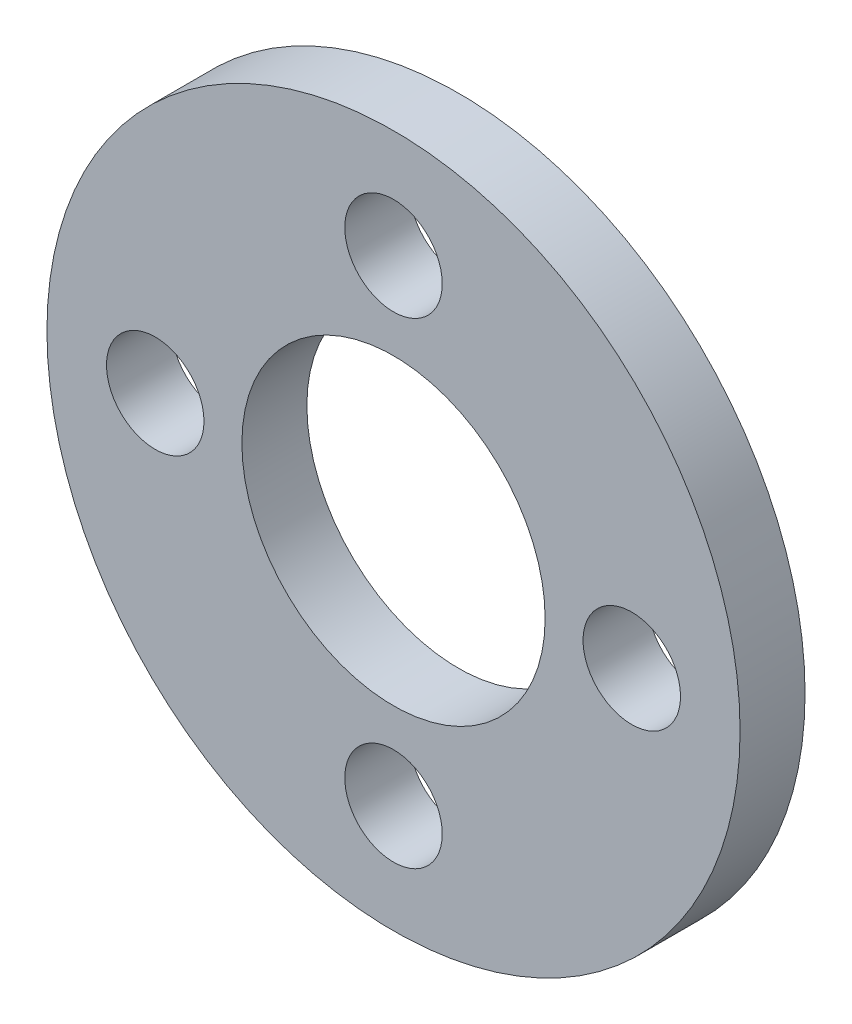
ISO-10303-21;
HEADER;
FILE_DESCRIPTION(('STEP AP214'),'2;1');
FILE_NAME('part.step','',(''),(''),'','','');
FILE_SCHEMA(('AUTOMOTIVE_DESIGN { 1 0 10303 214 1 1 1 1 }'));
ENDSEC;
DATA;
#1=APPLICATION_CONTEXT('core data for automotive mechanical design processes');
#2=APPLICATION_PROTOCOL_DEFINITION('international standard','automotive_design',2000,#1);
#3=PRODUCT_CONTEXT('',#1,'mechanical');
#4=PRODUCT('Part','Part','',(#3));
#5=PRODUCT_RELATED_PRODUCT_CATEGORY('part','',(#4));
#6=PRODUCT_DEFINITION_FORMATION('','',#4);
#7=PRODUCT_DEFINITION_CONTEXT('part definition',#1,'design');
#8=PRODUCT_DEFINITION('design','',#6,#7);
#9=PRODUCT_DEFINITION_SHAPE('','',#8);
#10=(LENGTH_UNIT() NAMED_UNIT(*) SI_UNIT(.MILLI.,.METRE.));
#11=(NAMED_UNIT(*) PLANE_ANGLE_UNIT() SI_UNIT($,.RADIAN.));
#12=(NAMED_UNIT(*) SI_UNIT($,.STERADIAN.) SOLID_ANGLE_UNIT());
#13=UNCERTAINTY_MEASURE_WITH_UNIT(LENGTH_MEASURE(1.E-05),#10,'distance_accuracy_value','');
#14=(GEOMETRIC_REPRESENTATION_CONTEXT(3) GLOBAL_UNCERTAINTY_ASSIGNED_CONTEXT((#13)) GLOBAL_UNIT_ASSIGNED_CONTEXT((#10,
#11,#12)) REPRESENTATION_CONTEXT('',''));
#15=CARTESIAN_POINT('',(0.,0.,0.));
#16=DIRECTION('',(0.,0.,1.));
#17=DIRECTION('',(1.,0.,0.));
#18=AXIS2_PLACEMENT_3D('',#15,#16,#17);
#19=CARTESIAN_POINT('',(0.,0.,3.));
#20=DIRECTION('',(0.,0.,1.));
#21=DIRECTION('',(1.,0.,0.));
#22=AXIS2_PLACEMENT_3D('',#19,#20,#21);
#23=PLANE('',#22);
#24=CARTESIAN_POINT('',(-11.,0.,3.));
#25=DIRECTION('',(0.,0.,1.));
#26=DIRECTION('',(1.,0.,0.));
#27=AXIS2_PLACEMENT_3D('',#24,#25,#26);
#28=CIRCLE('',#27,2.25);
#29=CARTESIAN_POINT('',(-8.75,0.,3.));
#30=VERTEX_POINT('',#29);
#31=EDGE_CURVE('E75',#30,#30,#28,.T.);
#32=ORIENTED_EDGE('',*,*,#31,.F.);
#33=EDGE_LOOP('',(#32));
#34=FACE_BOUND('',#33,.T.);
#35=CARTESIAN_POINT('',(11.,0.,3.));
#36=DIRECTION('',(0.,0.,1.));
#37=DIRECTION('',(1.,0.,0.));
#38=AXIS2_PLACEMENT_3D('',#35,#36,#37);
#39=CIRCLE('',#38,2.25);
#40=CARTESIAN_POINT('',(13.25,0.,3.));
#41=VERTEX_POINT('',#40);
#42=EDGE_CURVE('E59',#41,#41,#39,.T.);
#43=ORIENTED_EDGE('',*,*,#42,.F.);
#44=EDGE_LOOP('',(#43));
#45=FACE_BOUND('',#44,.T.);
#46=CARTESIAN_POINT('',(0.,0.,3.));
#47=DIRECTION('',(0.,0.,1.));
#48=DIRECTION('',(1.,0.,0.));
#49=AXIS2_PLACEMENT_3D('',#46,#47,#48);
#50=CIRCLE('',#49,16.);
#51=CARTESIAN_POINT('',(16.,0.,3.));
#52=VERTEX_POINT('',#51);
#53=EDGE_CURVE('E10',#52,#52,#50,.T.);
#54=ORIENTED_EDGE('',*,*,#53,.T.);
#55=EDGE_LOOP('',(#54));
#56=FACE_BOUND('',#55,.T.);
#57=CARTESIAN_POINT('',(0.,0.,3.));
#58=DIRECTION('',(0.,0.,1.));
#59=DIRECTION('',(1.,0.,0.));
#60=AXIS2_PLACEMENT_3D('',#57,#58,#59);
#61=CIRCLE('',#60,7.);
#62=CARTESIAN_POINT('',(7.,0.,3.));
#63=VERTEX_POINT('',#62);
#64=EDGE_CURVE('E53',#63,#63,#61,.T.);
#65=ORIENTED_EDGE('',*,*,#64,.F.);
#66=EDGE_LOOP('',(#65));
#67=FACE_BOUND('',#66,.T.);
#68=CARTESIAN_POINT('',(0.,11.,3.));
#69=DIRECTION('',(0.,0.,1.));
#70=DIRECTION('',(1.,0.,0.));
#71=AXIS2_PLACEMENT_3D('',#68,#69,#70);
#72=CIRCLE('',#71,2.25);
#73=CARTESIAN_POINT('',(2.25,11.,3.));
#74=VERTEX_POINT('',#73);
#75=EDGE_CURVE('E67',#74,#74,#72,.T.);
#76=ORIENTED_EDGE('',*,*,#75,.F.);
#77=EDGE_LOOP('',(#76));
#78=FACE_BOUND('',#77,.T.);
#79=CARTESIAN_POINT('',(0.,-11.,3.));
#80=DIRECTION('',(0.,0.,1.));
#81=DIRECTION('',(1.,0.,0.));
#82=AXIS2_PLACEMENT_3D('',#79,#80,#81);
#83=CIRCLE('',#82,2.25);
#84=CARTESIAN_POINT('',(2.25,-11.,3.));
#85=VERTEX_POINT('',#84);
#86=EDGE_CURVE('E83',#85,#85,#83,.T.);
#87=ORIENTED_EDGE('',*,*,#86,.F.);
#88=EDGE_LOOP('',(#87));
#89=FACE_BOUND('',#88,.T.);
#90=ADVANCED_FACE('F39',(#34,#45,#56,#67,#78,#89),#23,.T.);
#91=CARTESIAN_POINT('',(0.,0.,0.));
#92=DIRECTION('',(0.,0.,1.));
#93=DIRECTION('',(1.,0.,0.));
#94=AXIS2_PLACEMENT_3D('',#91,#92,#93);
#95=PLANE('',#94);
#96=CARTESIAN_POINT('',(0.,0.,0.));
#97=DIRECTION('',(0.,0.,1.));
#98=DIRECTION('',(1.,0.,0.));
#99=AXIS2_PLACEMENT_3D('',#96,#97,#98);
#100=CIRCLE('',#99,16.);
#101=CARTESIAN_POINT('',(16.,0.,0.));
#102=VERTEX_POINT('',#101);
#103=EDGE_CURVE('E43',#102,#102,#100,.T.);
#104=ORIENTED_EDGE('',*,*,#103,.F.);
#105=EDGE_LOOP('',(#104));
#106=FACE_BOUND('',#105,.T.);
#107=CARTESIAN_POINT('',(0.,0.,0.));
#108=DIRECTION('',(0.,0.,1.));
#109=DIRECTION('',(1.,0.,0.));
#110=AXIS2_PLACEMENT_3D('',#107,#108,#109);
#111=CIRCLE('',#110,7.);
#112=CARTESIAN_POINT('',(7.,0.,0.));
#113=VERTEX_POINT('',#112);
#114=EDGE_CURVE('E55',#113,#113,#111,.T.);
#115=ORIENTED_EDGE('',*,*,#114,.T.);
#116=EDGE_LOOP('',(#115));
#117=FACE_BOUND('',#116,.T.);
#118=CARTESIAN_POINT('',(11.,0.,0.));
#119=DIRECTION('',(0.,0.,1.));
#120=DIRECTION('',(1.,0.,0.));
#121=AXIS2_PLACEMENT_3D('',#118,#119,#120);
#122=CIRCLE('',#121,2.25);
#123=CARTESIAN_POINT('',(13.25,0.,0.));
#124=VERTEX_POINT('',#123);
#125=EDGE_CURVE('E63',#124,#124,#122,.T.);
#126=ORIENTED_EDGE('',*,*,#125,.T.);
#127=EDGE_LOOP('',(#126));
#128=FACE_BOUND('',#127,.T.);
#129=CARTESIAN_POINT('',(0.,11.,0.));
#130=DIRECTION('',(0.,0.,1.));
#131=DIRECTION('',(1.,0.,0.));
#132=AXIS2_PLACEMENT_3D('',#129,#130,#131);
#133=CIRCLE('',#132,2.25);
#134=CARTESIAN_POINT('',(2.25,11.,0.));
#135=VERTEX_POINT('',#134);
#136=EDGE_CURVE('E71',#135,#135,#133,.T.);
#137=ORIENTED_EDGE('',*,*,#136,.T.);
#138=EDGE_LOOP('',(#137));
#139=FACE_BOUND('',#138,.T.);
#140=CARTESIAN_POINT('',(-11.,0.,0.));
#141=DIRECTION('',(0.,0.,1.));
#142=DIRECTION('',(1.,0.,0.));
#143=AXIS2_PLACEMENT_3D('',#140,#141,#142);
#144=CIRCLE('',#143,2.25);
#145=CARTESIAN_POINT('',(-8.75,0.,0.));
#146=VERTEX_POINT('',#145);
#147=EDGE_CURVE('E79',#146,#146,#144,.T.);
#148=ORIENTED_EDGE('',*,*,#147,.T.);
#149=EDGE_LOOP('',(#148));
#150=FACE_BOUND('',#149,.T.);
#151=CARTESIAN_POINT('',(0.,-11.,0.));
#152=DIRECTION('',(0.,0.,1.));
#153=DIRECTION('',(1.,0.,0.));
#154=AXIS2_PLACEMENT_3D('',#151,#152,#153);
#155=CIRCLE('',#154,2.25);
#156=CARTESIAN_POINT('',(2.25,-11.,0.));
#157=VERTEX_POINT('',#156);
#158=EDGE_CURVE('E87',#157,#157,#155,.T.);
#159=ORIENTED_EDGE('',*,*,#158,.T.);
#160=EDGE_LOOP('',(#159));
#161=FACE_BOUND('',#160,.T.);
#162=ADVANCED_FACE('F100',(#106,#117,#128,#139,#150,#161),#95,.F.);
#163=CARTESIAN_POINT('',(0.,0.,3.));
#164=DIRECTION('',(0.,0.,-1.));
#165=DIRECTION('',(-1.,0.,0.));
#166=AXIS2_PLACEMENT_3D('',#163,#164,#165);
#167=CYLINDRICAL_SURFACE('',#166,16.);
#168=ORIENTED_EDGE('',*,*,#53,.F.);
#169=EDGE_LOOP('',(#168));
#170=FACE_BOUND('',#169,.T.);
#171=ORIENTED_EDGE('',*,*,#103,.T.);
#172=EDGE_LOOP('',(#171));
#173=FACE_BOUND('',#172,.T.);
#174=ADVANCED_FACE('F41',(#170,#173),#167,.T.);
#175=CARTESIAN_POINT('',(0.,0.,3.));
#176=DIRECTION('',(0.,0.,-1.));
#177=DIRECTION('',(-1.,0.,0.));
#178=AXIS2_PLACEMENT_3D('',#175,#176,#177);
#179=CYLINDRICAL_SURFACE('',#178,7.);
#180=ORIENTED_EDGE('',*,*,#64,.T.);
#181=EDGE_LOOP('',(#180));
#182=FACE_BOUND('',#181,.T.);
#183=ORIENTED_EDGE('',*,*,#114,.F.);
#184=EDGE_LOOP('',(#183));
#185=FACE_BOUND('',#184,.T.);
#186=ADVANCED_FACE('F110',(#182,#185),#179,.F.);
#187=CARTESIAN_POINT('',(11.,0.,3.));
#188=DIRECTION('',(0.,0.,-1.));
#189=DIRECTION('',(-1.,0.,0.));
#190=AXIS2_PLACEMENT_3D('',#187,#188,#189);
#191=CYLINDRICAL_SURFACE('',#190,2.25);
#192=ORIENTED_EDGE('',*,*,#42,.T.);
#193=EDGE_LOOP('',(#192));
#194=FACE_BOUND('',#193,.T.);
#195=ORIENTED_EDGE('',*,*,#125,.F.);
#196=EDGE_LOOP('',(#195));
#197=FACE_BOUND('',#196,.T.);
#198=ADVANCED_FACE('F113',(#194,#197),#191,.F.);
#199=CARTESIAN_POINT('',(0.,11.,3.));
#200=DIRECTION('',(0.,0.,-1.));
#201=DIRECTION('',(-1.,0.,0.));
#202=AXIS2_PLACEMENT_3D('',#199,#200,#201);
#203=CYLINDRICAL_SURFACE('',#202,2.25);
#204=ORIENTED_EDGE('',*,*,#75,.T.);
#205=EDGE_LOOP('',(#204));
#206=FACE_BOUND('',#205,.T.);
#207=ORIENTED_EDGE('',*,*,#136,.F.);
#208=EDGE_LOOP('',(#207));
#209=FACE_BOUND('',#208,.T.);
#210=ADVANCED_FACE('F117',(#206,#209),#203,.F.);
#211=CARTESIAN_POINT('',(-11.,0.,3.));
#212=DIRECTION('',(0.,0.,-1.));
#213=DIRECTION('',(-1.,0.,0.));
#214=AXIS2_PLACEMENT_3D('',#211,#212,#213);
#215=CYLINDRICAL_SURFACE('',#214,2.25);
#216=ORIENTED_EDGE('',*,*,#31,.T.);
#217=EDGE_LOOP('',(#216));
#218=FACE_BOUND('',#217,.T.);
#219=ORIENTED_EDGE('',*,*,#147,.F.);
#220=EDGE_LOOP('',(#219));
#221=FACE_BOUND('',#220,.T.);
#222=ADVANCED_FACE('F121',(#218,#221),#215,.F.);
#223=CARTESIAN_POINT('',(0.,-11.,3.));
#224=DIRECTION('',(0.,0.,-1.));
#225=DIRECTION('',(-1.,0.,0.));
#226=AXIS2_PLACEMENT_3D('',#223,#224,#225);
#227=CYLINDRICAL_SURFACE('',#226,2.25);
#228=ORIENTED_EDGE('',*,*,#86,.T.);
#229=EDGE_LOOP('',(#228));
#230=FACE_BOUND('',#229,.T.);
#231=ORIENTED_EDGE('',*,*,#158,.F.);
#232=EDGE_LOOP('',(#231));
#233=FACE_BOUND('',#232,.T.);
#234=ADVANCED_FACE('F96',(#230,#233),#227,.F.);
#235=CLOSED_SHELL('',(#90,#162,#174,#186,#198,#210,#222,#234));
#236=MANIFOLD_SOLID_BREP('B2',#235);
#237=ADVANCED_BREP_SHAPE_REPRESENTATION('',(#18,#236),#14);
#238=SHAPE_DEFINITION_REPRESENTATION(#9,#237);
ENDSEC;
END-ISO-10303-21;
